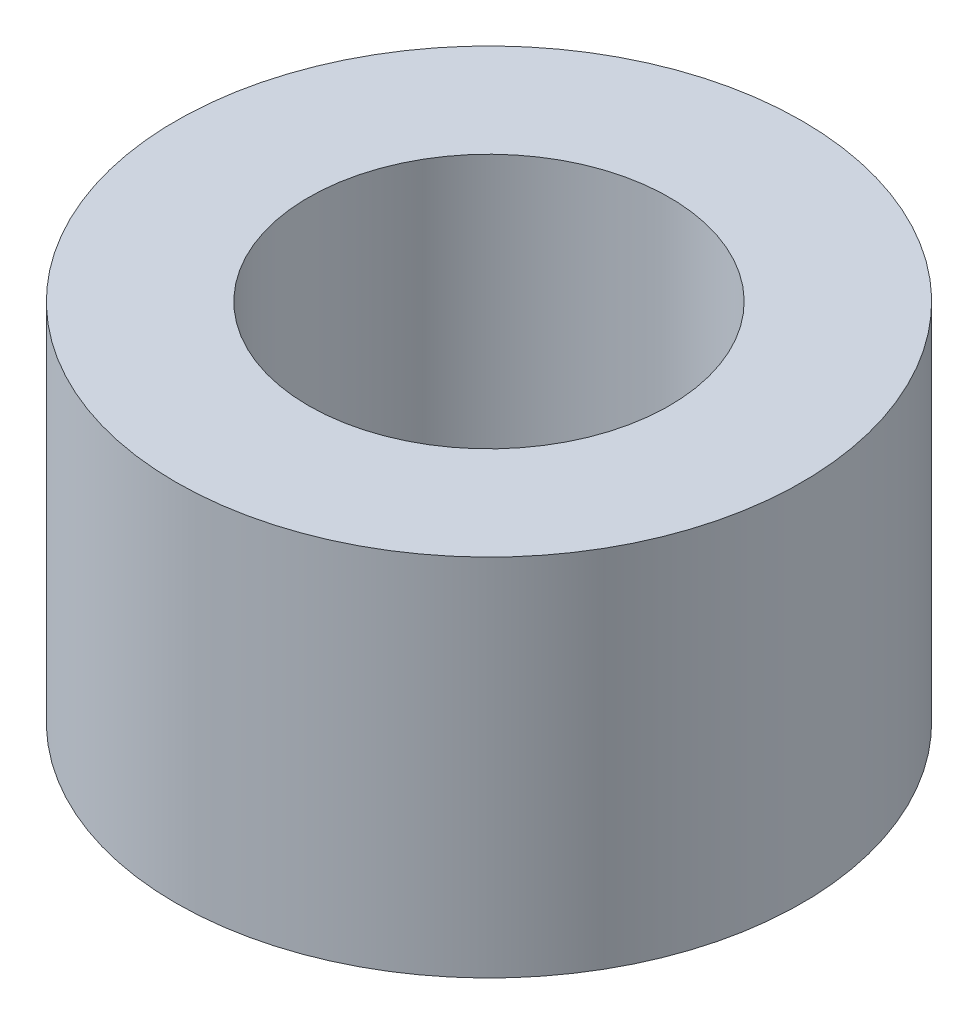
ISO-10303-21;
HEADER;
FILE_DESCRIPTION(('STEP AP214'),'2;1');
FILE_NAME('part.step','',(''),(''),'','','');
FILE_SCHEMA(('AUTOMOTIVE_DESIGN { 1 0 10303 214 1 1 1 1 }'));
ENDSEC;
DATA;
#1=APPLICATION_CONTEXT('core data for automotive mechanical design processes');
#2=APPLICATION_PROTOCOL_DEFINITION('international standard','automotive_design',2000,#1);
#3=PRODUCT_CONTEXT('',#1,'mechanical');
#4=PRODUCT('Part','Part','',(#3));
#5=PRODUCT_RELATED_PRODUCT_CATEGORY('part','',(#4));
#6=PRODUCT_DEFINITION_FORMATION('','',#4);
#7=PRODUCT_DEFINITION_CONTEXT('part definition',#1,'design');
#8=PRODUCT_DEFINITION('design','',#6,#7);
#9=PRODUCT_DEFINITION_SHAPE('','',#8);
#10=(LENGTH_UNIT() NAMED_UNIT(*) SI_UNIT(.MILLI.,.METRE.));
#11=(NAMED_UNIT(*) PLANE_ANGLE_UNIT() SI_UNIT($,.RADIAN.));
#12=(NAMED_UNIT(*) SI_UNIT($,.STERADIAN.) SOLID_ANGLE_UNIT());
#13=UNCERTAINTY_MEASURE_WITH_UNIT(LENGTH_MEASURE(1.E-05),#10,'distance_accuracy_value','');
#14=(GEOMETRIC_REPRESENTATION_CONTEXT(3) GLOBAL_UNCERTAINTY_ASSIGNED_CONTEXT((#13)) GLOBAL_UNIT_ASSIGNED_CONTEXT((#10,
#11,#12)) REPRESENTATION_CONTEXT('',''));
#15=CARTESIAN_POINT('',(0.,0.,0.));
#16=DIRECTION('',(0.,0.,1.));
#17=DIRECTION('',(1.,0.,0.));
#18=AXIS2_PLACEMENT_3D('',#15,#16,#17);
#19=CARTESIAN_POINT('',(0.,5.,0.));
#20=DIRECTION('',(0.,1.,0.));
#21=DIRECTION('',(0.,0.,1.));
#22=AXIS2_PLACEMENT_3D('',#19,#20,#21);
#23=PLANE('',#22);
#24=CARTESIAN_POINT('',(0.,5.,0.));
#25=DIRECTION('',(0.,1.,0.));
#26=DIRECTION('',(0.,0.,1.));
#27=AXIS2_PLACEMENT_3D('',#24,#25,#26);
#28=CIRCLE('',#27,4.29336734693878);
#29=CARTESIAN_POINT('',(0.,5.,4.29336734693878));
#30=VERTEX_POINT('',#29);
#31=EDGE_CURVE('E10',#30,#30,#28,.T.);
#32=ORIENTED_EDGE('',*,*,#31,.T.);
#33=EDGE_LOOP('',(#32));
#34=FACE_BOUND('',#33,.T.);
#35=CARTESIAN_POINT('',(0.,5.,0.));
#36=DIRECTION('',(0.,1.,0.));
#37=DIRECTION('',(0.,0.,1.));
#38=AXIS2_PLACEMENT_3D('',#35,#36,#37);
#39=CIRCLE('',#38,2.475);
#40=CARTESIAN_POINT('',(0.,5.,2.475));
#41=VERTEX_POINT('',#40);
#42=EDGE_CURVE('E42',#41,#41,#39,.T.);
#43=ORIENTED_EDGE('',*,*,#42,.F.);
#44=EDGE_LOOP('',(#43));
#45=FACE_BOUND('',#44,.T.);
#46=ADVANCED_FACE('F31',(#34,#45),#23,.T.);
#47=CARTESIAN_POINT('',(0.,0.,0.));
#48=DIRECTION('',(0.,1.,0.));
#49=DIRECTION('',(0.,0.,1.));
#50=AXIS2_PLACEMENT_3D('',#47,#48,#49);
#51=PLANE('',#50);
#52=CARTESIAN_POINT('',(0.,0.,0.));
#53=DIRECTION('',(0.,1.,0.));
#54=DIRECTION('',(0.,0.,1.));
#55=AXIS2_PLACEMENT_3D('',#52,#53,#54);
#56=CIRCLE('',#55,4.29336734693878);
#57=CARTESIAN_POINT('',(0.,0.,4.29336734693878));
#58=VERTEX_POINT('',#57);
#59=EDGE_CURVE('E35',#58,#58,#56,.T.);
#60=ORIENTED_EDGE('',*,*,#59,.F.);
#61=EDGE_LOOP('',(#60));
#62=FACE_BOUND('',#61,.T.);
#63=CARTESIAN_POINT('',(0.,0.,0.));
#64=DIRECTION('',(0.,1.,0.));
#65=DIRECTION('',(0.,0.,1.));
#66=AXIS2_PLACEMENT_3D('',#63,#64,#65);
#67=CIRCLE('',#66,2.475);
#68=CARTESIAN_POINT('',(0.,0.,2.475));
#69=VERTEX_POINT('',#68);
#70=EDGE_CURVE('E44',#69,#69,#67,.T.);
#71=ORIENTED_EDGE('',*,*,#70,.T.);
#72=EDGE_LOOP('',(#71));
#73=FACE_BOUND('',#72,.T.);
#74=ADVANCED_FACE('F54',(#62,#73),#51,.F.);
#75=CARTESIAN_POINT('',(0.,5.,0.));
#76=DIRECTION('',(0.,-1.,0.));
#77=DIRECTION('',(0.,0.,-1.));
#78=AXIS2_PLACEMENT_3D('',#75,#76,#77);
#79=CYLINDRICAL_SURFACE('',#78,4.29336734693878);
#80=ORIENTED_EDGE('',*,*,#31,.F.);
#81=EDGE_LOOP('',(#80));
#82=FACE_BOUND('',#81,.T.);
#83=ORIENTED_EDGE('',*,*,#59,.T.);
#84=EDGE_LOOP('',(#83));
#85=FACE_BOUND('',#84,.T.);
#86=ADVANCED_FACE('F33',(#82,#85),#79,.T.);
#87=CARTESIAN_POINT('',(0.,5.,0.));
#88=DIRECTION('',(0.,-1.,0.));
#89=DIRECTION('',(0.,0.,-1.));
#90=AXIS2_PLACEMENT_3D('',#87,#88,#89);
#91=CYLINDRICAL_SURFACE('',#90,2.475);
#92=ORIENTED_EDGE('',*,*,#42,.T.);
#93=EDGE_LOOP('',(#92));
#94=FACE_BOUND('',#93,.T.);
#95=ORIENTED_EDGE('',*,*,#70,.F.);
#96=EDGE_LOOP('',(#95));
#97=FACE_BOUND('',#96,.T.);
#98=ADVANCED_FACE('F50',(#94,#97),#91,.F.);
#99=CLOSED_SHELL('',(#46,#74,#86,#98));
#100=MANIFOLD_SOLID_BREP('B2',#99);
#101=ADVANCED_BREP_SHAPE_REPRESENTATION('',(#18,#100),#14);
#102=SHAPE_DEFINITION_REPRESENTATION(#9,#101);
ENDSEC;
END-ISO-10303-21;
